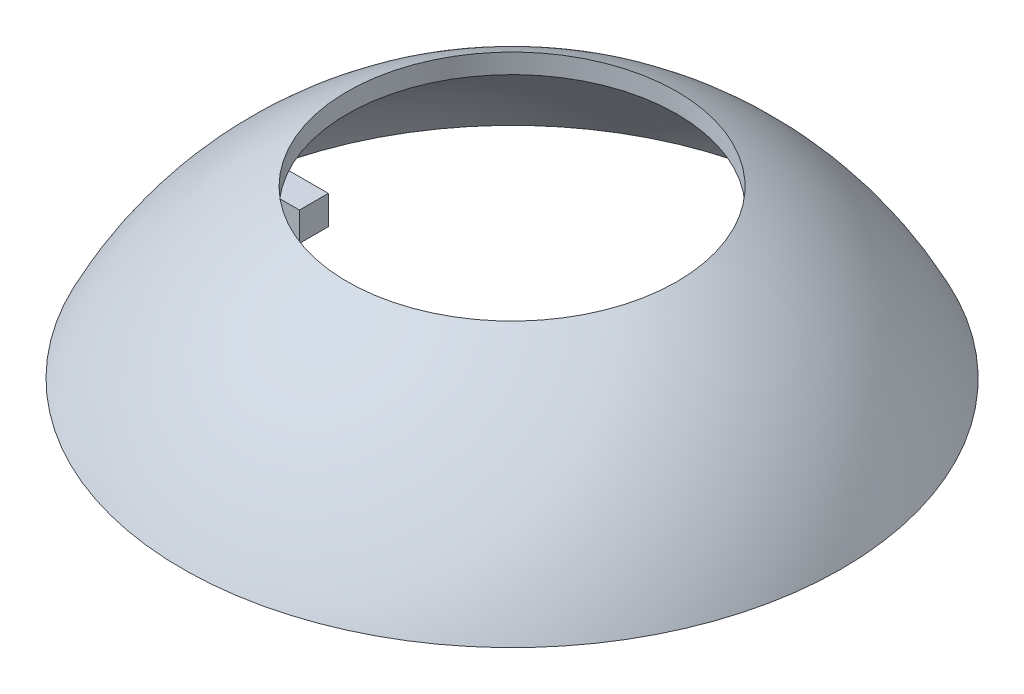
ISO-10303-21;
HEADER;
FILE_DESCRIPTION(('STEP AP214'),'2;1');
FILE_NAME('part.step','',(''),(''),'','','');
FILE_SCHEMA(('AUTOMOTIVE_DESIGN { 1 0 10303 214 1 1 1 1 }'));
ENDSEC;
DATA;
#1=APPLICATION_CONTEXT('core data for automotive mechanical design processes');
#2=APPLICATION_PROTOCOL_DEFINITION('international standard','automotive_design',2000,#1);
#3=PRODUCT_CONTEXT('',#1,'mechanical');
#4=PRODUCT('Part','Part','',(#3));
#5=PRODUCT_RELATED_PRODUCT_CATEGORY('part','',(#4));
#6=PRODUCT_DEFINITION_FORMATION('','',#4);
#7=PRODUCT_DEFINITION_CONTEXT('part definition',#1,'design');
#8=PRODUCT_DEFINITION('design','',#6,#7);
#9=PRODUCT_DEFINITION_SHAPE('','',#8);
#10=(LENGTH_UNIT() NAMED_UNIT(*) SI_UNIT(.MILLI.,.METRE.));
#11=(NAMED_UNIT(*) PLANE_ANGLE_UNIT() SI_UNIT($,.RADIAN.));
#12=(NAMED_UNIT(*) SI_UNIT($,.STERADIAN.) SOLID_ANGLE_UNIT());
#13=UNCERTAINTY_MEASURE_WITH_UNIT(LENGTH_MEASURE(1.E-05),#10,'distance_accuracy_value','');
#14=(GEOMETRIC_REPRESENTATION_CONTEXT(3) GLOBAL_UNCERTAINTY_ASSIGNED_CONTEXT((#13)) GLOBAL_UNIT_ASSIGNED_CONTEXT((#10,
#11,#12)) REPRESENTATION_CONTEXT('',''));
#15=CARTESIAN_POINT('',(0.,0.,0.));
#16=DIRECTION('',(0.,0.,1.));
#17=DIRECTION('',(1.,0.,0.));
#18=AXIS2_PLACEMENT_3D('',#15,#16,#17);
#19=CARTESIAN_POINT('',(0.,0.,0.));
#20=DIRECTION('',(0.,-1.,0.));
#21=DIRECTION('',(1.,0.,0.));
#22=AXIS2_PLACEMENT_3D('',#19,#20,#21);
#23=SPHERICAL_SURFACE('',#22,60.5);
#24=CARTESIAN_POINT('',(0.,0.,6.84893162487));
#25=DIRECTION('',(0.,0.,1.));
#26=DIRECTION('',(1.,0.,0.));
#27=AXIS2_PLACEMENT_3D('',#24,#25,#26);
#28=CIRCLE('',#27,60.111081637231);
#29=CARTESIAN_POINT('',(53.1986102788301,27.986603938313,6.84893162486961));
#30=VERTEX_POINT('',#29);
#31=CARTESIAN_POINT('',(50.2516277966668,32.986603938313,6.84893162486964));
#32=VERTEX_POINT('',#31);
#33=EDGE_CURVE('E209',#30,#32,#28,.T.);
#34=ORIENTED_EDGE('',*,*,#33,.F.);
#35=CARTESIAN_POINT('',(0.,27.986603938313,0.));
#36=DIRECTION('',(0.,-1.,0.));
#37=DIRECTION('',(0.,0.,-1.));
#38=AXIS2_PLACEMENT_3D('',#35,#36,#37);
#39=CIRCLE('',#38,53.6376733276156);
#40=CARTESIAN_POINT('',(-53.0147157338786,27.986603938313,8.15106837512986));
#41=VERTEX_POINT('',#40);
#42=EDGE_CURVE('E279',#30,#41,#39,.T.);
#43=ORIENTED_EDGE('',*,*,#42,.T.);
#44=CARTESIAN_POINT('',(0.,0.,8.15106837512986));
#45=DIRECTION('',(0.,0.,1.));
#46=DIRECTION('',(1.,0.,0.));
#47=AXIS2_PLACEMENT_3D('',#44,#45,#46);
#48=CIRCLE('',#47,59.9483951773853);
#49=CARTESIAN_POINT('',(-50.0569080643304,32.986603938313,8.15106837512985));
#50=VERTEX_POINT('',#49);
#51=EDGE_CURVE('E255',#50,#41,#48,.T.);
#52=ORIENTED_EDGE('',*,*,#51,.F.);
#53=CARTESIAN_POINT('',(0.,32.986603938313,0.));
#54=DIRECTION('',(0.,1.,0.));
#55=DIRECTION('',(0.,0.,1.));
#56=AXIS2_PLACEMENT_3D('',#53,#54,#55);
#57=CIRCLE('',#56,50.7162100379836);
#58=CARTESIAN_POINT('',(-50.2516277966667,32.986603938313,-6.84893162487014));
#59=VERTEX_POINT('',#58);
#60=EDGE_CURVE('E43',#59,#50,#57,.T.);
#61=ORIENTED_EDGE('',*,*,#60,.F.);
#62=CARTESIAN_POINT('',(0.,0.,-6.84893162487014));
#63=DIRECTION('',(0.,0.,-1.));
#64=DIRECTION('',(-1.,0.,0.));
#65=AXIS2_PLACEMENT_3D('',#62,#63,#64);
#66=CIRCLE('',#65,60.111081637231);
#67=CARTESIAN_POINT('',(-53.1986102788208,27.986603938313,-6.84893162487014));
#68=VERTEX_POINT('',#67);
#69=EDGE_CURVE('E267',#68,#59,#66,.T.);
#70=ORIENTED_EDGE('',*,*,#69,.F.);
#71=CARTESIAN_POINT('',(53.0147157338786,27.986603938313,-8.15106837513038));
#72=VERTEX_POINT('',#71);
#73=EDGE_CURVE('E280',#68,#72,#39,.T.);
#74=ORIENTED_EDGE('',*,*,#73,.T.);
#75=CARTESIAN_POINT('',(0.,0.,-8.15106837513001));
#76=DIRECTION('',(0.,0.,-1.));
#77=DIRECTION('',(-1.,0.,0.));
#78=AXIS2_PLACEMENT_3D('',#75,#76,#77);
#79=CIRCLE('',#78,59.9483951773853);
#80=CARTESIAN_POINT('',(50.0569080643303,32.986603938313,-8.15106837513036));
#81=VERTEX_POINT('',#80);
#82=EDGE_CURVE('E50',#81,#72,#79,.T.);
#83=ORIENTED_EDGE('',*,*,#82,.F.);
#84=CARTESIAN_POINT('',(0.,32.986603938313,0.));
#85=DIRECTION('',(0.,1.,0.));
#86=DIRECTION('',(0.,0.,1.));
#87=AXIS2_PLACEMENT_3D('',#84,#85,#86);
#88=CIRCLE('',#87,50.7162100379836);
#89=EDGE_CURVE('E11',#32,#81,#88,.T.);
#90=ORIENTED_EDGE('',*,*,#89,.F.);
#91=EDGE_LOOP('',(#34,#43,#52,#61,#70,#74,#83,#90));
#92=FACE_BOUND('',#91,.T.);
#93=CARTESIAN_POINT('',(0.,53.3666562565053,0.));
#94=DIRECTION('',(0.,-1.,0.));
#95=DIRECTION('',(0.,0.,-1.));
#96=AXIS2_PLACEMENT_3D('',#93,#94,#95);
#97=CIRCLE('',#96,28.5);
#98=CARTESIAN_POINT('',(0.,53.3666562565053,-28.5));
#99=VERTEX_POINT('',#98);
#100=EDGE_CURVE('E270',#99,#99,#97,.T.);
#101=ORIENTED_EDGE('',*,*,#100,.F.);
#102=EDGE_LOOP('',(#101));
#103=FACE_BOUND('',#102,.T.);
#104=ADVANCED_FACE('F36',(#92,#103),#23,.F.);
#105=CARTESIAN_POINT('',(57.,27.986603938313,0.));
#106=DIRECTION('',(0.,-1.,0.));
#107=DIRECTION('',(0.,0.,-1.));
#108=AXIS2_PLACEMENT_3D('',#105,#106,#107);
#109=PLANE('',#108);
#110=CARTESIAN_POINT('',(0.,27.986603938313,0.));
#111=DIRECTION('',(0.,-1.,0.));
#112=DIRECTION('',(0.,0.,-1.));
#113=AXIS2_PLACEMENT_3D('',#110,#111,#112);
#114=CIRCLE('',#113,57.);
#115=CARTESIAN_POINT('',(57.,27.986603938313,0.));
#116=VERTEX_POINT('',#115);
#117=EDGE_CURVE('E276',#116,#116,#114,.T.);
#118=ORIENTED_EDGE('',*,*,#117,.T.);
#119=EDGE_LOOP('',(#118));
#120=FACE_BOUND('',#119,.T.);
#121=ORIENTED_EDGE('',*,*,#73,.F.);
#122=DIRECTION('',(1.,0.,0.));
#123=VECTOR('',#122,1.);
#124=CARTESIAN_POINT('',(-53.1986102788208,27.986603938313,-6.84893162487014));
#125=LINE('',#124,#123);
#126=CARTESIAN_POINT('',(-38.6300569243688,27.986603938313,-6.84893162487014));
#127=VERTEX_POINT('',#126);
#128=EDGE_CURVE('E239',#68,#127,#125,.T.);
#129=ORIENTED_EDGE('',*,*,#128,.T.);
#130=DIRECTION('',(0.,0.,1.));
#131=VECTOR('',#130,1.);
#132=CARTESIAN_POINT('',(-38.6300569243688,27.986603938313,-6.84893162487014));
#133=LINE('',#132,#131);
#134=CARTESIAN_POINT('',(-38.6300569243688,27.986603938313,-1.84893162487014));
#135=VERTEX_POINT('',#134);
#136=EDGE_CURVE('E242',#127,#135,#133,.T.);
#137=ORIENTED_EDGE('',*,*,#136,.T.);
#138=DIRECTION('',(-1.,0.,0.));
#139=VECTOR('',#138,1.);
#140=CARTESIAN_POINT('',(-38.6300569243688,27.986603938313,-1.84893162487014));
#141=LINE('',#140,#139);
#142=CARTESIAN_POINT('',(-49.3797511224869,27.986603938313,-1.84893162487014));
#143=VERTEX_POINT('',#142);
#144=EDGE_CURVE('E245',#135,#143,#141,.T.);
#145=ORIENTED_EDGE('',*,*,#144,.T.);
#146=DIRECTION('',(0.,0.,1.));
#147=VECTOR('',#146,1.);
#148=CARTESIAN_POINT('',(-49.3797511224869,27.986603938313,-1.84893162487014));
#149=LINE('',#148,#147);
#150=CARTESIAN_POINT('',(-49.3797511224869,27.986603938313,3.15106837512986));
#151=VERTEX_POINT('',#150);
#152=EDGE_CURVE('E248',#143,#151,#149,.T.);
#153=ORIENTED_EDGE('',*,*,#152,.T.);
#154=DIRECTION('',(1.,0.,0.));
#155=VECTOR('',#154,1.);
#156=CARTESIAN_POINT('',(-49.3797511224869,27.986603938313,3.15106837512986));
#157=LINE('',#156,#155);
#158=CARTESIAN_POINT('',(-38.6300569243688,27.986603938313,3.15106837512986));
#159=VERTEX_POINT('',#158);
#160=EDGE_CURVE('E216',#151,#159,#157,.T.);
#161=ORIENTED_EDGE('',*,*,#160,.T.);
#162=DIRECTION('',(0.,0.,1.));
#163=VECTOR('',#162,1.);
#164=CARTESIAN_POINT('',(-38.6300569243688,27.986603938313,3.15106837512986));
#165=LINE('',#164,#163);
#166=CARTESIAN_POINT('',(-38.6300569243688,27.986603938313,8.15106837512986));
#167=VERTEX_POINT('',#166);
#168=EDGE_CURVE('E211',#159,#167,#165,.T.);
#169=ORIENTED_EDGE('',*,*,#168,.T.);
#170=DIRECTION('',(-1.,0.,0.));
#171=VECTOR('',#170,1.);
#172=CARTESIAN_POINT('',(-38.6300569243688,27.986603938313,8.15106837512986));
#173=LINE('',#172,#171);
#174=EDGE_CURVE('E236',#167,#41,#173,.T.);
#175=ORIENTED_EDGE('',*,*,#174,.T.);
#176=ORIENTED_EDGE('',*,*,#42,.F.);
#177=DIRECTION('',(-1.,0.,0.));
#178=VECTOR('',#177,1.);
#179=CARTESIAN_POINT('',(53.1986102788301,27.986603938313,6.84893162486961));
#180=LINE('',#179,#178);
#181=CARTESIAN_POINT('',(38.6300569243782,27.986603938313,6.84893162486972));
#182=VERTEX_POINT('',#181);
#183=EDGE_CURVE('E189',#30,#182,#180,.T.);
#184=ORIENTED_EDGE('',*,*,#183,.T.);
#185=DIRECTION('',(0.,0.,-1.));
#186=VECTOR('',#185,1.);
#187=CARTESIAN_POINT('',(38.6300569243782,27.986603938313,6.84893162486972));
#188=LINE('',#187,#186);
#189=CARTESIAN_POINT('',(38.6300569243781,27.986603938313,1.84893162486972));
#190=VERTEX_POINT('',#189);
#191=EDGE_CURVE('E192',#182,#190,#188,.T.);
#192=ORIENTED_EDGE('',*,*,#191,.T.);
#193=DIRECTION('',(1.,0.,0.));
#194=VECTOR('',#193,1.);
#195=CARTESIAN_POINT('',(38.6300569243781,27.986603938313,1.84893162486972));
#196=LINE('',#195,#194);
#197=CARTESIAN_POINT('',(49.3797511224963,27.986603938313,1.84893162486964));
#198=VERTEX_POINT('',#197);
#199=EDGE_CURVE('E195',#190,#198,#196,.T.);
#200=ORIENTED_EDGE('',*,*,#199,.T.);
#201=DIRECTION('',(0.,0.,-1.));
#202=VECTOR('',#201,1.);
#203=CARTESIAN_POINT('',(49.3797511224963,27.986603938313,1.84893162486964));
#204=LINE('',#203,#202);
#205=CARTESIAN_POINT('',(49.3797511224962,27.986603938313,-3.15106837513036));
#206=VERTEX_POINT('',#205);
#207=EDGE_CURVE('E172',#198,#206,#204,.T.);
#208=ORIENTED_EDGE('',*,*,#207,.T.);
#209=DIRECTION('',(-1.,0.,0.));
#210=VECTOR('',#209,1.);
#211=CARTESIAN_POINT('',(49.3797511224962,27.986603938313,-3.15106837513036));
#212=LINE('',#211,#210);
#213=CARTESIAN_POINT('',(38.6300569243781,27.986603938313,-3.15106837513028));
#214=VERTEX_POINT('',#213);
#215=EDGE_CURVE('E169',#206,#214,#212,.T.);
#216=ORIENTED_EDGE('',*,*,#215,.T.);
#217=DIRECTION('',(0.,0.,-1.));
#218=VECTOR('',#217,1.);
#219=CARTESIAN_POINT('',(38.6300569243781,27.986603938313,-3.15106837513028));
#220=LINE('',#219,#218);
#221=CARTESIAN_POINT('',(38.6300569243781,27.986603938313,-8.15106837513028));
#222=VERTEX_POINT('',#221);
#223=EDGE_CURVE('E186',#214,#222,#220,.T.);
#224=ORIENTED_EDGE('',*,*,#223,.T.);
#225=DIRECTION('',(1.,0.,0.));
#226=VECTOR('',#225,1.);
#227=CARTESIAN_POINT('',(38.6300569243781,27.986603938313,-8.15106837513028));
#228=LINE('',#227,#226);
#229=EDGE_CURVE('E150',#222,#72,#228,.T.);
#230=ORIENTED_EDGE('',*,*,#229,.T.);
#231=EDGE_LOOP('',(#121,#129,#137,#145,#153,#161,#169,#175,#176,#184,#192,#200,#208,#216,#224,#230));
#232=FACE_BOUND('',#231,.T.);
#233=ADVANCED_FACE('F316',(#120,#232),#109,.T.);
#234=CARTESIAN_POINT('',(0.,0.,0.));
#235=DIRECTION('',(0.,-1.,0.));
#236=DIRECTION('',(1.,0.,0.));
#237=AXIS2_PLACEMENT_3D('',#234,#235,#236);
#238=SPHERICAL_SURFACE('',#237,63.5);
#239=CARTESIAN_POINT('',(0.,56.7450438364444,0.));
#240=DIRECTION('',(0.,-1.,0.));
#241=DIRECTION('',(0.,0.,-1.));
#242=AXIS2_PLACEMENT_3D('',#239,#240,#241);
#243=CIRCLE('',#242,28.5);
#244=CARTESIAN_POINT('',(28.5,56.7450438364444,0.));
#245=VERTEX_POINT('',#244);
#246=EDGE_CURVE('E273',#245,#245,#243,.T.);
#247=CARTESIAN_POINT('',(28.5,56.7450438364444,0.));
#248=CARTESIAN_POINT('',(28.8835832044668,56.5523912313974,0.));
#249=CARTESIAN_POINT('',(29.2652123882611,56.3558481156444,0.));
#250=CARTESIAN_POINT('',(30.0244070931372,55.9550641847683,0.));
#251=CARTESIAN_POINT('',(30.401972614219,55.7508233696454,0.));
#252=CARTESIAN_POINT('',(31.1528843723025,55.3347273620717,0.));
#253=CARTESIAN_POINT('',(31.5262306093041,55.122872169621,0.));
#254=CARTESIAN_POINT('',(32.268550360753,54.6916347089442,0.));
#255=CARTESIAN_POINT('',(32.6375238752003,54.4722524407181,0.));
#256=CARTESIAN_POINT('',(33.3709464213024,54.0260509981639,0.));
#257=CARTESIAN_POINT('',(33.7353954529574,53.7992318238357,0.));
#258=CARTESIAN_POINT('',(34.4596191660121,53.3382498579666,0.));
#259=CARTESIAN_POINT('',(34.8193938474119,53.1040870664257,0.));
#260=CARTESIAN_POINT('',(35.5341209061367,52.6285141586563,0.));
#261=CARTESIAN_POINT('',(35.8890732834616,52.3871040424278,0.));
#262=CARTESIAN_POINT('',(36.5940097656259,51.8971357625354,0.));
#263=CARTESIAN_POINT('',(36.9439938704653,51.6485775988716,0.));
#264=CARTESIAN_POINT('',(37.6388498817578,51.1444154397177,0.));
#265=CARTESIAN_POINT('',(37.9837217882109,50.8888114442277,0.));
#266=CARTESIAN_POINT('',(38.6682115793114,50.3706627348382,0.));
#267=CARTESIAN_POINT('',(39.0078294639589,50.1081180209388,0.));
#268=CARTESIAN_POINT('',(39.681671548623,49.5761958423309,0.));
#269=CARTESIAN_POINT('',(40.0158957486397,49.3068183776223,0.));
#270=CARTESIAN_POINT('',(40.6788130193016,48.7613414748861,0.));
#271=CARTESIAN_POINT('',(41.0075060899469,48.4852420368585,0.));
#272=CARTESIAN_POINT('',(41.6592259317172,47.92643472928,0.));
#273=CARTESIAN_POINT('',(41.9822527028423,47.6437268597292,0.));
#274=CARTESIAN_POINT('',(42.6225071056058,47.0718189485213,0.));
#275=CARTESIAN_POINT('',(42.9397347372443,46.7826189068642,0.));
#276=CARTESIAN_POINT('',(43.5682604058781,46.1978455806695,0.));
#277=CARTESIAN_POINT('',(43.8795584428734,45.902272296132,0.));
#278=CARTESIAN_POINT('',(44.4960969055222,45.3048740343042,0.));
#279=CARTESIAN_POINT('',(44.8013373311757,45.0030490570138,0.));
#280=CARTESIAN_POINT('',(45.4056350455449,44.3932715307238,0.));
#281=CARTESIAN_POINT('',(45.7046923342607,44.0853189817241,0.));
#282=CARTESIAN_POINT('',(46.2965007918819,43.4634129529317,0.));
#283=CARTESIAN_POINT('',(46.5892519607873,43.149459473139,0.));
#284=CARTESIAN_POINT('',(47.1683277892135,42.5156806914708,0.));
#285=CARTESIAN_POINT('',(47.4546524487342,42.1958553895953,0.));
#286=CARTESIAN_POINT('',(48.0207575116232,41.5504644871712,0.));
#287=CARTESIAN_POINT('',(48.3005379149915,41.2248988866227,0.));
#288=CARTESIAN_POINT('',(48.8534394100359,40.5681612708751,0.));
#289=CARTESIAN_POINT('',(49.126560501712,40.2369892556759,0.));
#290=CARTESIAN_POINT('',(49.6660310563768,39.569175000205,0.));
#291=CARTESIAN_POINT('',(49.9323805193655,39.2325327599332,0.));
#292=CARTESIAN_POINT('',(50.4581982843862,38.5539164934408,0.));
#293=CARTESIAN_POINT('',(50.7176665864182,38.2119424672201,0.));
#294=CARTESIAN_POINT('',(51.2296153270541,37.5228032605832,0.));
#295=CARTESIAN_POINT('',(51.482095765658,37.1756380801669,0.));
#296=CARTESIAN_POINT('',(51.9799649505369,36.4762593316337,0.));
#297=CARTESIAN_POINT('',(52.225353696812,36.1240457635166,0.));
#298=CARTESIAN_POINT('',(52.7089385848012,35.4147150823141,0.));
#299=CARTESIAN_POINT('',(52.9471347265154,35.0575979692285,0.));
#300=CARTESIAN_POINT('',(53.4162364498255,34.3386070567233,0.));
#301=CARTESIAN_POINT('',(53.6471420314215,33.9767332573036,0.));
#302=CARTESIAN_POINT('',(54.1015676814655,33.24837778915,0.));
#303=CARTESIAN_POINT('',(54.3250877499137,32.881896120416,0.));
#304=CARTESIAN_POINT('',(54.7646504414203,32.1444756171046,0.));
#305=CARTESIAN_POINT('',(54.9806930644788,31.7735367825273,0.));
#306=CARTESIAN_POINT('',(55.4052120691394,31.0273545155415,0.));
#307=CARTESIAN_POINT('',(55.6136884507414,30.652111083133,0.));
#308=CARTESIAN_POINT('',(56.0229890595757,29.8974738407744,0.));
#309=CARTESIAN_POINT('',(56.2238132868078,29.5180800308242,0.));
#310=CARTESIAN_POINT('',(56.6177276730418,28.7552984005536,0.));
#311=CARTESIAN_POINT('',(56.8108178320436,28.3719105802331,0.));
#312=CARTESIAN_POINT('',(57.,27.986603938313,0.));
#313=B_SPLINE_CURVE_WITH_KNOTS('',3,(#247,#248,#249,#250,#251,#252,#253,#254,#255,#256,#257,
#258,#259,#260,#261,#262,#263,#264,#265,#266,#267,#268,#269,#270,#271,#272,#273,#274,#275,#276,
#277,#278,#279,#280,#281,#282,#283,#284,#285,#286,#287,#288,#289,#290,#291,#292,#293,#294,#295,
#296,#297,#298,#299,#300,#301,#302,#303,#304,#305,#306,#307,#308,#309,#310,#311,#312),
.UNSPECIFIED.,.F.,.F.,(4,2,2,2,2,2,2,2,2,2,2,2,2,2,2,2,2,2,2,2,2,2,2,2,2,2,2,2,2,2,2,2,4),(0.,
1.28771230566585,2.5754246113317,3.86313691699755,5.15084922266339,6.43856152832925,
7.72627383399508,9.01398613966093,10.3016984453268,11.5894107509926,12.8771230566585,
14.1648353623243,15.4525476679902,16.740259973656,18.0279722793219,19.3156845849877,
20.6033968906536,21.8911091963194,23.1788215019853,24.4665338076511,25.7542461133169,
27.0419584189828,28.3296707246486,29.6173830303145,30.9050953359803,32.1928076416462,
33.480519947312,34.7682322529779,36.0559445586437,37.3436568643096,38.6313691699754,
39.9190814756413,41.2067937813071),.UNSPECIFIED.);
#314=EDGE_CURVE('BSEAM347',#245,#116,#313,.T.);
#315=ORIENTED_EDGE('',*,*,#246,.T.);
#316=ORIENTED_EDGE('',*,*,#117,.F.);
#317=ORIENTED_EDGE('',*,*,#314,.T.);
#318=ORIENTED_EDGE('',*,*,#314,.F.);
#319=EDGE_LOOP('',(#315,#317,#316,#318));
#320=FACE_BOUND('',#319,.T.);
#321=ADVANCED_FACE('F347',(#320),#238,.T.);
#322=CARTESIAN_POINT('',(0.,10.0584372751729,0.));
#323=DIRECTION('',(0.,-1.,0.));
#324=DIRECTION('',(0.,0.,-1.));
#325=AXIS2_PLACEMENT_3D('',#322,#323,#324);
#326=CYLINDRICAL_SURFACE('',#325,28.5);
#327=ORIENTED_EDGE('',*,*,#100,.T.);
#328=EDGE_LOOP('',(#327));
#329=FACE_BOUND('',#328,.T.);
#330=ORIENTED_EDGE('',*,*,#246,.F.);
#331=EDGE_LOOP('',(#330));
#332=FACE_BOUND('',#331,.T.);
#333=ADVANCED_FACE('F352',(#329,#332),#326,.F.);
#334=CARTESIAN_POINT('',(4.63518112781003E-12,32.986603938313,0.));
#335=DIRECTION('',(0.,1.,0.));
#336=DIRECTION('',(0.,0.,1.));
#337=AXIS2_PLACEMENT_3D('',#334,#335,#336);
#338=PLANE('',#337);
#339=DIRECTION('',(1.,0.,0.));
#340=VECTOR('',#339,1.);
#341=CARTESIAN_POINT('',(-53.1986102788208,32.986603938313,-6.84893162487014));
#342=LINE('',#341,#340);
#343=CARTESIAN_POINT('',(-38.6300569243688,32.986603938313,-6.84893162487014));
#344=VERTEX_POINT('',#343);
#345=EDGE_CURVE('E219',#59,#344,#342,.T.);
#346=ORIENTED_EDGE('',*,*,#345,.F.);
#347=ORIENTED_EDGE('',*,*,#60,.T.);
#348=DIRECTION('',(-1.,0.,0.));
#349=VECTOR('',#348,1.);
#350=CARTESIAN_POINT('',(-38.6300569243688,32.986603938313,8.15106837512986));
#351=LINE('',#350,#349);
#352=CARTESIAN_POINT('',(-38.6300569243688,32.986603938313,8.15106837512986));
#353=VERTEX_POINT('',#352);
#354=EDGE_CURVE('E215',#353,#50,#351,.T.);
#355=ORIENTED_EDGE('',*,*,#354,.F.);
#356=DIRECTION('',(0.,0.,1.));
#357=VECTOR('',#356,1.);
#358=CARTESIAN_POINT('',(-38.6300569243688,32.986603938313,3.15106837512986));
#359=LINE('',#358,#357);
#360=CARTESIAN_POINT('',(-38.6300569243688,32.986603938313,3.15106837512986));
#361=VERTEX_POINT('',#360);
#362=EDGE_CURVE('E212',#361,#353,#359,.T.);
#363=ORIENTED_EDGE('',*,*,#362,.F.);
#364=DIRECTION('',(1.,0.,0.));
#365=VECTOR('',#364,1.);
#366=CARTESIAN_POINT('',(-49.3797511224869,32.986603938313,3.15106837512986));
#367=LINE('',#366,#365);
#368=CARTESIAN_POINT('',(-49.3797511224869,32.986603938313,3.15106837512986));
#369=VERTEX_POINT('',#368);
#370=EDGE_CURVE('E230',#369,#361,#367,.T.);
#371=ORIENTED_EDGE('',*,*,#370,.F.);
#372=DIRECTION('',(0.,0.,1.));
#373=VECTOR('',#372,1.);
#374=CARTESIAN_POINT('',(-49.3797511224869,32.986603938313,-1.84893162487014));
#375=LINE('',#374,#373);
#376=CARTESIAN_POINT('',(-49.3797511224869,32.986603938313,-1.84893162487014));
#377=VERTEX_POINT('',#376);
#378=EDGE_CURVE('E227',#377,#369,#375,.T.);
#379=ORIENTED_EDGE('',*,*,#378,.F.);
#380=DIRECTION('',(-1.,0.,0.));
#381=VECTOR('',#380,1.);
#382=CARTESIAN_POINT('',(-38.6300569243688,32.986603938313,-1.84893162487014));
#383=LINE('',#382,#381);
#384=CARTESIAN_POINT('',(-38.6300569243688,32.986603938313,-1.84893162487014));
#385=VERTEX_POINT('',#384);
#386=EDGE_CURVE('E224',#385,#377,#383,.T.);
#387=ORIENTED_EDGE('',*,*,#386,.F.);
#388=DIRECTION('',(0.,0.,1.));
#389=VECTOR('',#388,1.);
#390=CARTESIAN_POINT('',(-38.6300569243688,32.986603938313,-6.84893162487014));
#391=LINE('',#390,#389);
#392=EDGE_CURVE('E221',#344,#385,#391,.T.);
#393=ORIENTED_EDGE('',*,*,#392,.F.);
#394=EDGE_LOOP('',(#346,#347,#355,#363,#371,#379,#387,#393));
#395=FACE_BOUND('',#394,.T.);
#396=ADVANCED_FACE('F285',(#395),#338,.T.);
#397=CARTESIAN_POINT('',(-38.6300569243688,32.986603938313,3.15106837512986));
#398=DIRECTION('',(1.,0.,0.));
#399=DIRECTION('',(0.,0.,-1.));
#400=AXIS2_PLACEMENT_3D('',#397,#398,#399);
#401=PLANE('',#400);
#402=ORIENTED_EDGE('',*,*,#168,.F.);
#403=DIRECTION('',(0.,-1.,0.));
#404=VECTOR('',#403,1.);
#405=CARTESIAN_POINT('',(-38.6300569243688,32.986603938313,3.15106837512986));
#406=LINE('',#405,#404);
#407=EDGE_CURVE('E253',#361,#159,#406,.T.);
#408=ORIENTED_EDGE('',*,*,#407,.F.);
#409=ORIENTED_EDGE('',*,*,#362,.T.);
#410=DIRECTION('',(0.,-1.,0.));
#411=VECTOR('',#410,1.);
#412=CARTESIAN_POINT('',(-38.6300569243688,32.986603938313,8.15106837512986));
#413=LINE('',#412,#411);
#414=EDGE_CURVE('E233',#353,#167,#413,.T.);
#415=ORIENTED_EDGE('',*,*,#414,.T.);
#416=EDGE_LOOP('',(#402,#408,#409,#415));
#417=FACE_BOUND('',#416,.T.);
#418=ADVANCED_FACE('F294',(#417),#401,.T.);
#419=CARTESIAN_POINT('',(-49.3797511224869,32.986603938313,3.15106837512986));
#420=DIRECTION('',(0.,0.,-1.));
#421=DIRECTION('',(-1.,0.,0.));
#422=AXIS2_PLACEMENT_3D('',#419,#420,#421);
#423=PLANE('',#422);
#424=ORIENTED_EDGE('',*,*,#160,.F.);
#425=DIRECTION('',(0.,-1.,0.));
#426=VECTOR('',#425,1.);
#427=CARTESIAN_POINT('',(-49.3797511224869,32.986603938313,3.15106837512986));
#428=LINE('',#427,#426);
#429=EDGE_CURVE('E256',#369,#151,#428,.T.);
#430=ORIENTED_EDGE('',*,*,#429,.F.);
#431=ORIENTED_EDGE('',*,*,#370,.T.);
#432=ORIENTED_EDGE('',*,*,#407,.T.);
#433=EDGE_LOOP('',(#424,#430,#431,#432));
#434=FACE_BOUND('',#433,.T.);
#435=ADVANCED_FACE('F299',(#434),#423,.T.);
#436=CARTESIAN_POINT('',(-49.3797511224869,32.986603938313,-1.84893162487014));
#437=DIRECTION('',(1.,0.,0.));
#438=DIRECTION('',(0.,0.,-1.));
#439=AXIS2_PLACEMENT_3D('',#436,#437,#438);
#440=PLANE('',#439);
#441=ORIENTED_EDGE('',*,*,#152,.F.);
#442=DIRECTION('',(0.,-1.,0.));
#443=VECTOR('',#442,1.);
#444=CARTESIAN_POINT('',(-49.3797511224869,32.986603938313,-1.84893162487014));
#445=LINE('',#444,#443);
#446=EDGE_CURVE('E258',#377,#143,#445,.T.);
#447=ORIENTED_EDGE('',*,*,#446,.F.);
#448=ORIENTED_EDGE('',*,*,#378,.T.);
#449=ORIENTED_EDGE('',*,*,#429,.T.);
#450=EDGE_LOOP('',(#441,#447,#448,#449));
#451=FACE_BOUND('',#450,.T.);
#452=ADVANCED_FACE('F302',(#451),#440,.T.);
#453=CARTESIAN_POINT('',(-38.6300569243688,32.986603938313,-1.84893162487014));
#454=DIRECTION('',(0.,0.,1.));
#455=DIRECTION('',(1.,0.,0.));
#456=AXIS2_PLACEMENT_3D('',#453,#454,#455);
#457=PLANE('',#456);
#458=ORIENTED_EDGE('',*,*,#144,.F.);
#459=DIRECTION('',(0.,-1.,0.));
#460=VECTOR('',#459,1.);
#461=CARTESIAN_POINT('',(-38.6300569243688,32.986603938313,-1.84893162487014));
#462=LINE('',#461,#460);
#463=EDGE_CURVE('E260',#385,#135,#462,.T.);
#464=ORIENTED_EDGE('',*,*,#463,.F.);
#465=ORIENTED_EDGE('',*,*,#386,.T.);
#466=ORIENTED_EDGE('',*,*,#446,.T.);
#467=EDGE_LOOP('',(#458,#464,#465,#466));
#468=FACE_BOUND('',#467,.T.);
#469=ADVANCED_FACE('F306',(#468),#457,.T.);
#470=CARTESIAN_POINT('',(-38.6300569243688,32.986603938313,-6.84893162487014));
#471=DIRECTION('',(1.,0.,0.));
#472=DIRECTION('',(0.,0.,-1.));
#473=AXIS2_PLACEMENT_3D('',#470,#471,#472);
#474=PLANE('',#473);
#475=ORIENTED_EDGE('',*,*,#136,.F.);
#476=DIRECTION('',(0.,-1.,0.));
#477=VECTOR('',#476,1.);
#478=CARTESIAN_POINT('',(-38.6300569243688,32.986603938313,-6.84893162487014));
#479=LINE('',#478,#477);
#480=EDGE_CURVE('E262',#344,#127,#479,.T.);
#481=ORIENTED_EDGE('',*,*,#480,.F.);
#482=ORIENTED_EDGE('',*,*,#392,.T.);
#483=ORIENTED_EDGE('',*,*,#463,.T.);
#484=EDGE_LOOP('',(#475,#481,#482,#483));
#485=FACE_BOUND('',#484,.T.);
#486=ADVANCED_FACE('F309',(#485),#474,.T.);
#487=CARTESIAN_POINT('',(-53.1986102788208,32.986603938313,-6.84893162487014));
#488=DIRECTION('',(0.,0.,-1.));
#489=DIRECTION('',(-1.,0.,0.));
#490=AXIS2_PLACEMENT_3D('',#487,#488,#489);
#491=PLANE('',#490);
#492=ORIENTED_EDGE('',*,*,#128,.F.);
#493=ORIENTED_EDGE('',*,*,#69,.T.);
#494=ORIENTED_EDGE('',*,*,#345,.T.);
#495=ORIENTED_EDGE('',*,*,#480,.T.);
#496=EDGE_LOOP('',(#492,#493,#494,#495));
#497=FACE_BOUND('',#496,.T.);
#498=ADVANCED_FACE('F313',(#497),#491,.T.);
#499=CARTESIAN_POINT('',(-38.6300569243688,32.986603938313,8.15106837512986));
#500=DIRECTION('',(0.,0.,1.));
#501=DIRECTION('',(1.,0.,0.));
#502=AXIS2_PLACEMENT_3D('',#499,#500,#501);
#503=PLANE('',#502);
#504=ORIENTED_EDGE('',*,*,#354,.T.);
#505=ORIENTED_EDGE('',*,*,#51,.T.);
#506=ORIENTED_EDGE('',*,*,#174,.F.);
#507=ORIENTED_EDGE('',*,*,#414,.F.);
#508=EDGE_LOOP('',(#504,#505,#506,#507));
#509=FACE_BOUND('',#508,.T.);
#510=ADVANCED_FACE('F290',(#509),#503,.T.);
#511=CARTESIAN_POINT('',(4.63518112781003E-12,32.986603938313,0.));
#512=DIRECTION('',(0.,1.,0.));
#513=DIRECTION('',(0.,0.,1.));
#514=AXIS2_PLACEMENT_3D('',#511,#512,#513);
#515=PLANE('',#514);
#516=DIRECTION('',(-1.,0.,0.));
#517=VECTOR('',#516,1.);
#518=CARTESIAN_POINT('',(53.1986102788301,32.986603938313,6.84893162486961));
#519=LINE('',#518,#517);
#520=CARTESIAN_POINT('',(38.6300569243782,32.986603938313,6.84893162486972));
#521=VERTEX_POINT('',#520);
#522=EDGE_CURVE('E165',#32,#521,#519,.T.);
#523=ORIENTED_EDGE('',*,*,#522,.F.);
#524=ORIENTED_EDGE('',*,*,#89,.T.);
#525=DIRECTION('',(1.,0.,0.));
#526=VECTOR('',#525,1.);
#527=CARTESIAN_POINT('',(38.6300569243781,32.986603938313,-8.15106837513028));
#528=LINE('',#527,#526);
#529=CARTESIAN_POINT('',(38.6300569243781,32.986603938313,-8.15106837513028));
#530=VERTEX_POINT('',#529);
#531=EDGE_CURVE('E148',#530,#81,#528,.T.);
#532=ORIENTED_EDGE('',*,*,#531,.F.);
#533=DIRECTION('',(0.,0.,-1.));
#534=VECTOR('',#533,1.);
#535=CARTESIAN_POINT('',(38.6300569243781,32.986603938313,-3.15106837513028));
#536=LINE('',#535,#534);
#537=CARTESIAN_POINT('',(38.6300569243781,32.986603938313,-3.15106837513028));
#538=VERTEX_POINT('',#537);
#539=EDGE_CURVE('E163',#538,#530,#536,.T.);
#540=ORIENTED_EDGE('',*,*,#539,.F.);
#541=DIRECTION('',(-1.,0.,0.));
#542=VECTOR('',#541,1.);
#543=CARTESIAN_POINT('',(49.3797511224962,32.986603938313,-3.15106837513036));
#544=LINE('',#543,#542);
#545=CARTESIAN_POINT('',(49.3797511224962,32.986603938313,-3.15106837513036));
#546=VERTEX_POINT('',#545);
#547=EDGE_CURVE('E156',#546,#538,#544,.T.);
#548=ORIENTED_EDGE('',*,*,#547,.F.);
#549=DIRECTION('',(0.,0.,-1.));
#550=VECTOR('',#549,1.);
#551=CARTESIAN_POINT('',(49.3797511224963,32.986603938313,1.84893162486964));
#552=LINE('',#551,#550);
#553=CARTESIAN_POINT('',(49.3797511224963,32.986603938313,1.84893162486964));
#554=VERTEX_POINT('',#553);
#555=EDGE_CURVE('E182',#554,#546,#552,.T.);
#556=ORIENTED_EDGE('',*,*,#555,.F.);
#557=DIRECTION('',(1.,0.,0.));
#558=VECTOR('',#557,1.);
#559=CARTESIAN_POINT('',(38.6300569243781,32.986603938313,1.84893162486972));
#560=LINE('',#559,#558);
#561=CARTESIAN_POINT('',(38.6300569243781,32.986603938313,1.84893162486972));
#562=VERTEX_POINT('',#561);
#563=EDGE_CURVE('E179',#562,#554,#560,.T.);
#564=ORIENTED_EDGE('',*,*,#563,.F.);
#565=DIRECTION('',(0.,0.,-1.));
#566=VECTOR('',#565,1.);
#567=CARTESIAN_POINT('',(38.6300569243782,32.986603938313,6.84893162486972));
#568=LINE('',#567,#566);
#569=EDGE_CURVE('E176',#521,#562,#568,.T.);
#570=ORIENTED_EDGE('',*,*,#569,.F.);
#571=EDGE_LOOP('',(#523,#524,#532,#540,#548,#556,#564,#570));
#572=FACE_BOUND('',#571,.T.);
#573=ADVANCED_FACE('F161',(#572),#515,.T.);
#574=CARTESIAN_POINT('',(38.6300569243781,32.986603938313,-3.15106837513028));
#575=DIRECTION('',(-1.,0.,0.));
#576=DIRECTION('',(0.,0.,1.));
#577=AXIS2_PLACEMENT_3D('',#574,#575,#576);
#578=PLANE('',#577);
#579=ORIENTED_EDGE('',*,*,#223,.F.);
#580=DIRECTION('',(0.,-1.,0.));
#581=VECTOR('',#580,1.);
#582=CARTESIAN_POINT('',(38.6300569243781,32.986603938313,-3.15106837513028));
#583=LINE('',#582,#581);
#584=EDGE_CURVE('E168',#538,#214,#583,.T.);
#585=ORIENTED_EDGE('',*,*,#584,.F.);
#586=ORIENTED_EDGE('',*,*,#539,.T.);
#587=DIRECTION('',(0.,-1.,0.));
#588=VECTOR('',#587,1.);
#589=CARTESIAN_POINT('',(38.6300569243781,32.986603938313,-8.15106837513028));
#590=LINE('',#589,#588);
#591=EDGE_CURVE('E145',#530,#222,#590,.T.);
#592=ORIENTED_EDGE('',*,*,#591,.T.);
#593=EDGE_LOOP('',(#579,#585,#586,#592));
#594=FACE_BOUND('',#593,.T.);
#595=ADVANCED_FACE('F167',(#594),#578,.T.);
#596=CARTESIAN_POINT('',(49.3797511224962,32.986603938313,-3.15106837513036));
#597=DIRECTION('',(0.,0.,1.));
#598=DIRECTION('',(1.,0.,0.));
#599=AXIS2_PLACEMENT_3D('',#596,#597,#598);
#600=PLANE('',#599);
#601=ORIENTED_EDGE('',*,*,#215,.F.);
#602=DIRECTION('',(0.,-1.,0.));
#603=VECTOR('',#602,1.);
#604=CARTESIAN_POINT('',(49.3797511224962,32.986603938313,-3.15106837513036));
#605=LINE('',#604,#603);
#606=EDGE_CURVE('E201',#546,#206,#605,.T.);
#607=ORIENTED_EDGE('',*,*,#606,.F.);
#608=ORIENTED_EDGE('',*,*,#547,.T.);
#609=ORIENTED_EDGE('',*,*,#584,.T.);
#610=EDGE_LOOP('',(#601,#607,#608,#609));
#611=FACE_BOUND('',#610,.T.);
#612=ADVANCED_FACE('F320',(#611),#600,.T.);
#613=CARTESIAN_POINT('',(49.3797511224963,32.986603938313,1.84893162486964));
#614=DIRECTION('',(-1.,0.,0.));
#615=DIRECTION('',(0.,0.,1.));
#616=AXIS2_PLACEMENT_3D('',#613,#614,#615);
#617=PLANE('',#616);
#618=ORIENTED_EDGE('',*,*,#207,.F.);
#619=DIRECTION('',(0.,-1.,0.));
#620=VECTOR('',#619,1.);
#621=CARTESIAN_POINT('',(49.3797511224963,32.986603938313,1.84893162486964));
#622=LINE('',#621,#620);
#623=EDGE_CURVE('E203',#554,#198,#622,.T.);
#624=ORIENTED_EDGE('',*,*,#623,.F.);
#625=ORIENTED_EDGE('',*,*,#555,.T.);
#626=ORIENTED_EDGE('',*,*,#606,.T.);
#627=EDGE_LOOP('',(#618,#624,#625,#626));
#628=FACE_BOUND('',#627,.T.);
#629=ADVANCED_FACE('F380',(#628),#617,.T.);
#630=CARTESIAN_POINT('',(38.6300569243781,32.986603938313,1.84893162486972));
#631=DIRECTION('',(0.,0.,-1.));
#632=DIRECTION('',(-1.,0.,0.));
#633=AXIS2_PLACEMENT_3D('',#630,#631,#632);
#634=PLANE('',#633);
#635=ORIENTED_EDGE('',*,*,#199,.F.);
#636=DIRECTION('',(0.,-1.,0.));
#637=VECTOR('',#636,1.);
#638=CARTESIAN_POINT('',(38.6300569243781,32.986603938313,1.84893162486972));
#639=LINE('',#638,#637);
#640=EDGE_CURVE('E205',#562,#190,#639,.T.);
#641=ORIENTED_EDGE('',*,*,#640,.F.);
#642=ORIENTED_EDGE('',*,*,#563,.T.);
#643=ORIENTED_EDGE('',*,*,#623,.T.);
#644=EDGE_LOOP('',(#635,#641,#642,#643));
#645=FACE_BOUND('',#644,.T.);
#646=ADVANCED_FACE('F327',(#645),#634,.T.);
#647=CARTESIAN_POINT('',(38.6300569243782,32.986603938313,6.84893162486972));
#648=DIRECTION('',(-1.,0.,0.));
#649=DIRECTION('',(0.,0.,1.));
#650=AXIS2_PLACEMENT_3D('',#647,#648,#649);
#651=PLANE('',#650);
#652=ORIENTED_EDGE('',*,*,#191,.F.);
#653=DIRECTION('',(0.,-1.,0.));
#654=VECTOR('',#653,1.);
#655=CARTESIAN_POINT('',(38.6300569243782,32.986603938313,6.84893162486972));
#656=LINE('',#655,#654);
#657=EDGE_CURVE('E155',#521,#182,#656,.T.);
#658=ORIENTED_EDGE('',*,*,#657,.F.);
#659=ORIENTED_EDGE('',*,*,#569,.T.);
#660=ORIENTED_EDGE('',*,*,#640,.T.);
#661=EDGE_LOOP('',(#652,#658,#659,#660));
#662=FACE_BOUND('',#661,.T.);
#663=ADVANCED_FACE('F330',(#662),#651,.T.);
#664=CARTESIAN_POINT('',(53.1986102788301,32.986603938313,6.84893162486961));
#665=DIRECTION('',(0.,0.,1.));
#666=DIRECTION('',(1.,0.,0.));
#667=AXIS2_PLACEMENT_3D('',#664,#665,#666);
#668=PLANE('',#667);
#669=ORIENTED_EDGE('',*,*,#183,.F.);
#670=ORIENTED_EDGE('',*,*,#33,.T.);
#671=ORIENTED_EDGE('',*,*,#522,.T.);
#672=ORIENTED_EDGE('',*,*,#657,.T.);
#673=EDGE_LOOP('',(#669,#670,#671,#672));
#674=FACE_BOUND('',#673,.T.);
#675=ADVANCED_FACE('F334',(#674),#668,.T.);
#676=CARTESIAN_POINT('',(38.6300569243781,32.986603938313,-8.15106837513028));
#677=DIRECTION('',(0.,0.,-1.));
#678=DIRECTION('',(-1.,0.,0.));
#679=AXIS2_PLACEMENT_3D('',#676,#677,#678);
#680=PLANE('',#679);
#681=ORIENTED_EDGE('',*,*,#531,.T.);
#682=ORIENTED_EDGE('',*,*,#82,.T.);
#683=ORIENTED_EDGE('',*,*,#229,.F.);
#684=ORIENTED_EDGE('',*,*,#591,.F.);
#685=EDGE_LOOP('',(#681,#682,#683,#684));
#686=FACE_BOUND('',#685,.T.);
#687=ADVANCED_FACE('F147',(#686),#680,.T.);
#688=CLOSED_SHELL('',(#104,#233,#321,#333,#396,#418,#435,#452,#469,#486,#498,#510,#573,#595,
#612,#629,#646,#663,#675,#687));
#689=MANIFOLD_SOLID_BREP('B2',#688);
#690=ADVANCED_BREP_SHAPE_REPRESENTATION('',(#18,#689),#14);
#691=SHAPE_DEFINITION_REPRESENTATION(#9,#690);
ENDSEC;
END-ISO-10303-21;
